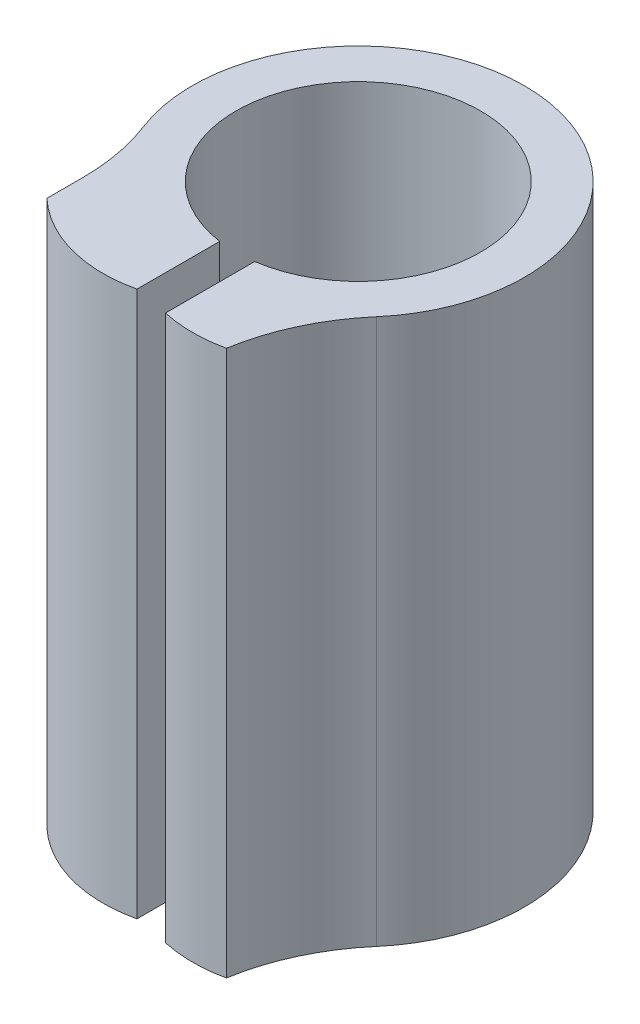
ISO-10303-21;
HEADER;
FILE_DESCRIPTION(('STEP AP214'),'2;1');
FILE_NAME('part.step','',(''),(''),'','','');
FILE_SCHEMA(('AUTOMOTIVE_DESIGN { 1 0 10303 214 1 1 1 1 }'));
ENDSEC;
DATA;
#1=APPLICATION_CONTEXT('core data for automotive mechanical design processes');
#2=APPLICATION_PROTOCOL_DEFINITION('international standard','automotive_design',2000,#1);
#3=PRODUCT_CONTEXT('',#1,'mechanical');
#4=PRODUCT('Part','Part','',(#3));
#5=PRODUCT_RELATED_PRODUCT_CATEGORY('part','',(#4));
#6=PRODUCT_DEFINITION_FORMATION('','',#4);
#7=PRODUCT_DEFINITION_CONTEXT('part definition',#1,'design');
#8=PRODUCT_DEFINITION('design','',#6,#7);
#9=PRODUCT_DEFINITION_SHAPE('','',#8);
#10=(LENGTH_UNIT() NAMED_UNIT(*) SI_UNIT(.MILLI.,.METRE.));
#11=(NAMED_UNIT(*) PLANE_ANGLE_UNIT() SI_UNIT($,.RADIAN.));
#12=(NAMED_UNIT(*) SI_UNIT($,.STERADIAN.) SOLID_ANGLE_UNIT());
#13=UNCERTAINTY_MEASURE_WITH_UNIT(LENGTH_MEASURE(1.E-05),#10,'distance_accuracy_value','');
#14=(GEOMETRIC_REPRESENTATION_CONTEXT(3) GLOBAL_UNCERTAINTY_ASSIGNED_CONTEXT((#13)) GLOBAL_UNIT_ASSIGNED_CONTEXT((#10,
#11,#12)) REPRESENTATION_CONTEXT('',''));
#15=CARTESIAN_POINT('',(0.,0.,0.));
#16=DIRECTION('',(0.,0.,1.));
#17=DIRECTION('',(1.,0.,0.));
#18=AXIS2_PLACEMENT_3D('',#15,#16,#17);
#19=CARTESIAN_POINT('',(0.,78.,0.));
#20=DIRECTION('',(0.,-1.,0.));
#21=DIRECTION('',(0.,0.,-1.));
#22=AXIS2_PLACEMENT_3D('',#19,#20,#21);
#23=CYLINDRICAL_SURFACE('',#22,14.3);
#24=CARTESIAN_POINT('',(0.,39.,0.));
#25=DIRECTION('',(0.,1.,0.));
#26=DIRECTION('',(0.,0.,1.));
#27=AXIS2_PLACEMENT_3D('',#24,#25,#26);
#28=CIRCLE('',#27,14.3);
#29=CARTESIAN_POINT('',(-2.5,39.,14.0797727254384));
#30=VERTEX_POINT('',#29);
#31=CARTESIAN_POINT('',(2.5,39.,14.0797727254384));
#32=VERTEX_POINT('',#31);
#33=EDGE_CURVE('E127',#30,#32,#28,.F.);
#34=ORIENTED_EDGE('',*,*,#33,.F.);
#35=DIRECTION('',(0.,-1.,0.));
#36=VECTOR('',#35,1.);
#37=CARTESIAN_POINT('',(-2.5,78.,14.0797727254384));
#38=LINE('',#37,#36);
#39=CARTESIAN_POINT('',(-2.5,0.,14.0797727254384));
#40=VERTEX_POINT('',#39);
#41=EDGE_CURVE('E189',#30,#40,#38,.T.);
#42=ORIENTED_EDGE('',*,*,#41,.T.);
#43=CARTESIAN_POINT('',(0.,0.,0.));
#44=DIRECTION('',(0.,-1.,0.));
#45=DIRECTION('',(0.,0.,1.));
#46=AXIS2_PLACEMENT_3D('',#43,#44,#45);
#47=CIRCLE('',#46,14.3);
#48=CARTESIAN_POINT('',(2.5,0.,14.0797727254384));
#49=VERTEX_POINT('',#48);
#50=EDGE_CURVE('E181',#40,#49,#47,.T.);
#51=ORIENTED_EDGE('',*,*,#50,.T.);
#52=DIRECTION('',(0.,-1.,0.));
#53=VECTOR('',#52,1.);
#54=CARTESIAN_POINT('',(2.5,78.,14.0797727254384));
#55=LINE('',#54,#53);
#56=EDGE_CURVE('E187',#32,#49,#55,.T.);
#57=ORIENTED_EDGE('',*,*,#56,.F.);
#58=EDGE_LOOP('',(#34,#42,#51,#57));
#59=FACE_BOUND('',#58,.T.);
#60=ADVANCED_FACE('F39',(#59),#23,.F.);
#61=CARTESIAN_POINT('',(6.86,78.,10.2433281022852));
#62=DIRECTION('',(0.,-1.,0.));
#63=DIRECTION('',(0.,0.,-1.));
#64=AXIS2_PLACEMENT_3D('',#61,#62,#63);
#65=CYLINDRICAL_SURFACE('',#64,20.3067244689253);
#66=CARTESIAN_POINT('',(6.86,0.,10.2433281022852));
#67=DIRECTION('',(0.,1.,0.));
#68=DIRECTION('',(0.,0.,1.));
#69=AXIS2_PLACEMENT_3D('',#66,#67,#68);
#70=CIRCLE('',#69,20.3067244689253);
#71=CARTESIAN_POINT('',(2.5,0.,30.0764685156652));
#72=VERTEX_POINT('',#71);
#73=CARTESIAN_POINT('',(11.22,0.,30.0764685156652));
#74=VERTEX_POINT('',#73);
#75=EDGE_CURVE('E153',#72,#74,#70,.T.);
#76=ORIENTED_EDGE('',*,*,#75,.T.);
#77=DIRECTION('',(0.,-1.,0.));
#78=VECTOR('',#77,1.);
#79=CARTESIAN_POINT('',(11.22,78.,30.0764685156652));
#80=LINE('',#79,#78);
#81=CARTESIAN_POINT('',(11.22,78.,30.0764685156652));
#82=VERTEX_POINT('',#81);
#83=EDGE_CURVE('E132',#82,#74,#80,.T.);
#84=ORIENTED_EDGE('',*,*,#83,.F.);
#85=CARTESIAN_POINT('',(6.86,78.,10.2433281022852));
#86=DIRECTION('',(0.,1.,0.));
#87=DIRECTION('',(0.,0.,1.));
#88=AXIS2_PLACEMENT_3D('',#85,#86,#87);
#89=CIRCLE('',#88,20.3067244689253);
#90=CARTESIAN_POINT('',(2.5,78.,30.0764685156652));
#91=VERTEX_POINT('',#90);
#92=EDGE_CURVE('E154',#91,#82,#89,.T.);
#93=ORIENTED_EDGE('',*,*,#92,.F.);
#94=DIRECTION('',(0.,-1.,0.));
#95=VECTOR('',#94,1.);
#96=CARTESIAN_POINT('',(2.5,78.,30.0764685156652));
#97=LINE('',#96,#95);
#98=EDGE_CURVE('E167',#91,#72,#97,.T.);
#99=ORIENTED_EDGE('',*,*,#98,.T.);
#100=EDGE_LOOP('',(#76,#84,#93,#99));
#101=FACE_BOUND('',#100,.T.);
#102=ADVANCED_FACE('F235',(#101),#65,.T.);
#103=CARTESIAN_POINT('',(0.,78.,0.));
#104=DIRECTION('',(0.,-1.,0.));
#105=DIRECTION('',(0.,0.,-1.));
#106=AXIS2_PLACEMENT_3D('',#103,#104,#105);
#107=CYLINDRICAL_SURFACE('',#106,23.75);
#108=CARTESIAN_POINT('',(0.,78.,0.));
#109=DIRECTION('',(0.,1.,0.));
#110=DIRECTION('',(0.,0.,1.));
#111=AXIS2_PLACEMENT_3D('',#108,#109,#110);
#112=CIRCLE('',#111,23.75);
#113=CARTESIAN_POINT('',(18.0359011807081,78.,15.4521444660517));
#114=VERTEX_POINT('',#113);
#115=CARTESIAN_POINT('',(-22.176976744186,78.,8.49965896303088));
#116=VERTEX_POINT('',#115);
#117=EDGE_CURVE('E156',#114,#116,#112,.T.);
#118=ORIENTED_EDGE('',*,*,#117,.F.);
#119=DIRECTION('',(0.,-1.,0.));
#120=VECTOR('',#119,1.);
#121=CARTESIAN_POINT('',(18.0359011807081,78.,15.4521444660517));
#122=LINE('',#121,#120);
#123=CARTESIAN_POINT('',(18.0359011807081,0.,15.4521444660517));
#124=VERTEX_POINT('',#123);
#125=EDGE_CURVE('E200',#114,#124,#122,.T.);
#126=ORIENTED_EDGE('',*,*,#125,.T.);
#127=CARTESIAN_POINT('',(0.,0.,0.));
#128=DIRECTION('',(0.,1.,0.));
#129=DIRECTION('',(0.,0.,1.));
#130=AXIS2_PLACEMENT_3D('',#127,#128,#129);
#131=CIRCLE('',#130,23.75);
#132=CARTESIAN_POINT('',(-22.176976744186,0.,8.49965896303088));
#133=VERTEX_POINT('',#132);
#134=EDGE_CURVE('E170',#124,#133,#131,.T.);
#135=ORIENTED_EDGE('',*,*,#134,.T.);
#136=DIRECTION('',(0.,-1.,0.));
#137=VECTOR('',#136,1.);
#138=CARTESIAN_POINT('',(-22.176976744186,78.,8.49965896303088));
#139=LINE('',#138,#137);
#140=EDGE_CURVE('E131',#133,#116,#139,.F.);
#141=ORIENTED_EDGE('',*,*,#140,.T.);
#142=EDGE_LOOP('',(#118,#126,#135,#141));
#143=FACE_BOUND('',#142,.T.);
#144=ADVANCED_FACE('F216',(#143),#107,.T.);
#145=CARTESIAN_POINT('',(-20.19,78.,24.3399795766288));
#146=DIRECTION('',(1.,0.,0.));
#147=DIRECTION('',(0.,0.,-1.));
#148=AXIS2_PLACEMENT_3D('',#145,#146,#147);
#149=PLANE('',#148);
#150=DIRECTION('',(0.,0.,1.));
#151=VECTOR('',#150,1.);
#152=CARTESIAN_POINT('',(-20.19,78.,24.3399795766288));
#153=LINE('',#152,#151);
#154=CARTESIAN_POINT('',(-20.19,78.,19.2360702847541));
#155=VERTEX_POINT('',#154);
#156=CARTESIAN_POINT('',(-20.19,78.,24.3399795766288));
#157=VERTEX_POINT('',#156);
#158=EDGE_CURVE('E159',#155,#157,#153,.T.);
#159=ORIENTED_EDGE('',*,*,#158,.F.);
#160=DIRECTION('',(0.,1.,0.));
#161=VECTOR('',#160,1.);
#162=CARTESIAN_POINT('',(-20.19,0.,19.2360702847541));
#163=LINE('',#162,#161);
#164=CARTESIAN_POINT('',(-20.19,0.,19.2360702847541));
#165=VERTEX_POINT('',#164);
#166=EDGE_CURVE('E203',#155,#165,#163,.F.);
#167=ORIENTED_EDGE('',*,*,#166,.T.);
#168=DIRECTION('',(0.,0.,1.));
#169=VECTOR('',#168,1.);
#170=CARTESIAN_POINT('',(-20.19,0.,24.3399795766288));
#171=LINE('',#170,#169);
#172=CARTESIAN_POINT('',(-20.19,0.,24.3399795766288));
#173=VERTEX_POINT('',#172);
#174=EDGE_CURVE('E173',#165,#173,#171,.T.);
#175=ORIENTED_EDGE('',*,*,#174,.T.);
#176=DIRECTION('',(0.,-1.,0.));
#177=VECTOR('',#176,1.);
#178=CARTESIAN_POINT('',(-20.19,78.,24.3399795766288));
#179=LINE('',#178,#177);
#180=EDGE_CURVE('E194',#157,#173,#179,.T.);
#181=ORIENTED_EDGE('',*,*,#180,.F.);
#182=EDGE_LOOP('',(#159,#167,#175,#181));
#183=FACE_BOUND('',#182,.T.);
#184=ADVANCED_FACE('F219',(#183),#149,.F.);
#185=CARTESIAN_POINT('',(-6.86,78.,10.2433281022852));
#186=DIRECTION('',(0.,-1.,0.));
#187=DIRECTION('',(0.,0.,-1.));
#188=AXIS2_PLACEMENT_3D('',#185,#186,#187);
#189=CYLINDRICAL_SURFACE('',#188,19.4011464297632);
#190=CARTESIAN_POINT('',(-6.86,0.,10.2433281022852));
#191=DIRECTION('',(0.,1.,0.));
#192=DIRECTION('',(0.,0.,-1.));
#193=AXIS2_PLACEMENT_3D('',#190,#191,#192);
#194=CIRCLE('',#193,19.4011464297632);
#195=CARTESIAN_POINT('',(-2.5,0.,29.1482185486516));
#196=VERTEX_POINT('',#195);
#197=EDGE_CURVE('E175',#173,#196,#194,.T.);
#198=ORIENTED_EDGE('',*,*,#197,.T.);
#199=DIRECTION('',(0.,-1.,0.));
#200=VECTOR('',#199,1.);
#201=CARTESIAN_POINT('',(-2.5,78.,29.1482185486516));
#202=LINE('',#201,#200);
#203=CARTESIAN_POINT('',(-2.5,78.,29.1482185486516));
#204=VERTEX_POINT('',#203);
#205=EDGE_CURVE('E191',#204,#196,#202,.T.);
#206=ORIENTED_EDGE('',*,*,#205,.F.);
#207=CARTESIAN_POINT('',(-6.86,78.,10.2433281022852));
#208=DIRECTION('',(0.,1.,0.));
#209=DIRECTION('',(0.,0.,-1.));
#210=AXIS2_PLACEMENT_3D('',#207,#208,#209);
#211=CIRCLE('',#210,19.4011464297632);
#212=EDGE_CURVE('E161',#157,#204,#211,.T.);
#213=ORIENTED_EDGE('',*,*,#212,.F.);
#214=ORIENTED_EDGE('',*,*,#180,.T.);
#215=EDGE_LOOP('',(#198,#206,#213,#214));
#216=FACE_BOUND('',#215,.T.);
#217=ADVANCED_FACE('F226',(#216),#189,.T.);
#218=CARTESIAN_POINT('',(-2.5,78.,14.0797727254384));
#219=DIRECTION('',(-1.,0.,0.));
#220=DIRECTION('',(0.,0.,1.));
#221=AXIS2_PLACEMENT_3D('',#218,#219,#220);
#222=PLANE('',#221);
#223=DIRECTION('',(0.,0.,-1.));
#224=VECTOR('',#223,1.);
#225=CARTESIAN_POINT('',(-2.5,39.,14.0797727254384));
#226=LINE('',#225,#224);
#227=CARTESIAN_POINT('',(-2.5,39.,17.3205080756888));
#228=VERTEX_POINT('',#227);
#229=EDGE_CURVE('E151',#228,#30,#226,.T.);
#230=ORIENTED_EDGE('',*,*,#229,.F.);
#231=DIRECTION('',(0.,1.,0.));
#232=VECTOR('',#231,1.);
#233=CARTESIAN_POINT('',(-2.5,39.,17.3205080756888));
#234=LINE('',#233,#232);
#235=CARTESIAN_POINT('',(-2.5,78.,17.3205080756888));
#236=VERTEX_POINT('',#235);
#237=EDGE_CURVE('E139',#228,#236,#234,.T.);
#238=ORIENTED_EDGE('',*,*,#237,.T.);
#239=DIRECTION('',(0.,0.,-1.));
#240=VECTOR('',#239,1.);
#241=CARTESIAN_POINT('',(-2.5,78.,21.0064685156652));
#242=LINE('',#241,#240);
#243=EDGE_CURVE('E163',#204,#236,#242,.T.);
#244=ORIENTED_EDGE('',*,*,#243,.F.);
#245=ORIENTED_EDGE('',*,*,#205,.T.);
#246=DIRECTION('',(0.,0.,-1.));
#247=VECTOR('',#246,1.);
#248=CARTESIAN_POINT('',(-2.5,0.,14.0797727254384));
#249=LINE('',#248,#247);
#250=EDGE_CURVE('E178',#196,#40,#249,.T.);
#251=ORIENTED_EDGE('',*,*,#250,.T.);
#252=ORIENTED_EDGE('',*,*,#41,.F.);
#253=EDGE_LOOP('',(#230,#238,#244,#245,#251,#252));
#254=FACE_BOUND('',#253,.T.);
#255=ADVANCED_FACE('F228',(#254),#222,.F.);
#256=CARTESIAN_POINT('',(2.5,78.,21.0064685156652));
#257=DIRECTION('',(1.,0.,0.));
#258=DIRECTION('',(0.,0.,-1.));
#259=AXIS2_PLACEMENT_3D('',#256,#257,#258);
#260=PLANE('',#259);
#261=DIRECTION('',(0.,0.,1.));
#262=VECTOR('',#261,1.);
#263=CARTESIAN_POINT('',(2.5,78.,14.0797727254384));
#264=LINE('',#263,#262);
#265=CARTESIAN_POINT('',(2.5,78.,17.3205080756888));
#266=VERTEX_POINT('',#265);
#267=EDGE_CURVE('E145',#266,#91,#264,.T.);
#268=ORIENTED_EDGE('',*,*,#267,.F.);
#269=DIRECTION('',(0.,1.,0.));
#270=VECTOR('',#269,1.);
#271=CARTESIAN_POINT('',(2.5,39.,17.3205080756888));
#272=LINE('',#271,#270);
#273=CARTESIAN_POINT('',(2.5,39.,17.3205080756888));
#274=VERTEX_POINT('',#273);
#275=EDGE_CURVE('E136',#266,#274,#272,.F.);
#276=ORIENTED_EDGE('',*,*,#275,.T.);
#277=DIRECTION('',(0.,0.,1.));
#278=VECTOR('',#277,1.);
#279=CARTESIAN_POINT('',(2.5,39.,21.0064685156652));
#280=LINE('',#279,#278);
#281=EDGE_CURVE('E121',#32,#274,#280,.T.);
#282=ORIENTED_EDGE('',*,*,#281,.F.);
#283=ORIENTED_EDGE('',*,*,#56,.T.);
#284=DIRECTION('',(0.,0.,1.));
#285=VECTOR('',#284,1.);
#286=CARTESIAN_POINT('',(2.5,0.,21.0064685156652));
#287=LINE('',#286,#285);
#288=EDGE_CURVE('E157',#49,#72,#287,.T.);
#289=ORIENTED_EDGE('',*,*,#288,.T.);
#290=ORIENTED_EDGE('',*,*,#98,.F.);
#291=EDGE_LOOP('',(#268,#276,#282,#283,#289,#290));
#292=FACE_BOUND('',#291,.T.);
#293=ADVANCED_FACE('F143',(#292),#260,.F.);
#294=CARTESIAN_POINT('',(6.86,78.,10.2433281022852));
#295=DIRECTION('',(0.,1.,0.));
#296=DIRECTION('',(0.,0.,1.));
#297=AXIS2_PLACEMENT_3D('',#294,#295,#296);
#298=PLANE('',#297);
#299=CARTESIAN_POINT('',(0.,78.,0.));
#300=DIRECTION('',(0.,1.,0.));
#301=DIRECTION('',(0.,0.,1.));
#302=AXIS2_PLACEMENT_3D('',#299,#300,#301);
#303=CIRCLE('',#302,17.5);
#304=EDGE_CURVE('E140',#266,#236,#303,.T.);
#305=ORIENTED_EDGE('',*,*,#304,.F.);
#306=ORIENTED_EDGE('',*,*,#267,.T.);
#307=ORIENTED_EDGE('',*,*,#92,.T.);
#308=CARTESIAN_POINT('',(40.8180921458132,78.,34.970642738959));
#309=DIRECTION('',(0.,1.,0.));
#310=DIRECTION('',(0.,0.,1.));
#311=AXIS2_PLACEMENT_3D('',#308,#309,#310);
#312=CIRCLE('',#311,30.);
#313=EDGE_CURVE('E207',#82,#114,#312,.F.);
#314=ORIENTED_EDGE('',*,*,#313,.T.);
#315=ORIENTED_EDGE('',*,*,#117,.T.);
#316=CARTESIAN_POINT('',(-50.19,78.,19.2360702847541));
#317=DIRECTION('',(0.,1.,0.));
#318=DIRECTION('',(0.,0.,1.));
#319=AXIS2_PLACEMENT_3D('',#316,#317,#318);
#320=CIRCLE('',#319,30.);
#321=EDGE_CURVE('E11',#116,#155,#320,.F.);
#322=ORIENTED_EDGE('',*,*,#321,.T.);
#323=ORIENTED_EDGE('',*,*,#158,.T.);
#324=ORIENTED_EDGE('',*,*,#212,.T.);
#325=ORIENTED_EDGE('',*,*,#243,.T.);
#326=EDGE_LOOP('',(#305,#306,#307,#314,#315,#322,#323,#324,#325));
#327=FACE_BOUND('',#326,.T.);
#328=ADVANCED_FACE('F222',(#327),#298,.T.);
#329=CARTESIAN_POINT('',(6.86,0.,10.2433281022852));
#330=DIRECTION('',(0.,1.,0.));
#331=DIRECTION('',(0.,0.,1.));
#332=AXIS2_PLACEMENT_3D('',#329,#330,#331);
#333=PLANE('',#332);
#334=ORIENTED_EDGE('',*,*,#75,.F.);
#335=ORIENTED_EDGE('',*,*,#288,.F.);
#336=ORIENTED_EDGE('',*,*,#50,.F.);
#337=ORIENTED_EDGE('',*,*,#250,.F.);
#338=ORIENTED_EDGE('',*,*,#197,.F.);
#339=ORIENTED_EDGE('',*,*,#174,.F.);
#340=CARTESIAN_POINT('',(-50.19,0.,19.2360702847541));
#341=DIRECTION('',(0.,1.,0.));
#342=DIRECTION('',(0.,0.,1.));
#343=AXIS2_PLACEMENT_3D('',#340,#341,#342);
#344=CIRCLE('',#343,30.);
#345=EDGE_CURVE('E47',#165,#133,#344,.T.);
#346=ORIENTED_EDGE('',*,*,#345,.T.);
#347=ORIENTED_EDGE('',*,*,#134,.F.);
#348=CARTESIAN_POINT('',(40.8180921458132,0.,34.970642738959));
#349=DIRECTION('',(0.,1.,0.));
#350=DIRECTION('',(0.,0.,1.));
#351=AXIS2_PLACEMENT_3D('',#348,#349,#350);
#352=CIRCLE('',#351,30.);
#353=EDGE_CURVE('E205',#124,#74,#352,.T.);
#354=ORIENTED_EDGE('',*,*,#353,.T.);
#355=EDGE_LOOP('',(#334,#335,#336,#337,#338,#339,#346,#347,#354));
#356=FACE_BOUND('',#355,.T.);
#357=ADVANCED_FACE('F212',(#356),#333,.F.);
#358=CARTESIAN_POINT('',(0.,39.,0.));
#359=DIRECTION('',(0.,1.,0.));
#360=DIRECTION('',(0.,0.,1.));
#361=AXIS2_PLACEMENT_3D('',#358,#359,#360);
#362=PLANE('',#361);
#363=ORIENTED_EDGE('',*,*,#229,.T.);
#364=ORIENTED_EDGE('',*,*,#33,.T.);
#365=ORIENTED_EDGE('',*,*,#281,.T.);
#366=CARTESIAN_POINT('',(0.,39.,0.));
#367=DIRECTION('',(0.,1.,0.));
#368=DIRECTION('',(0.,0.,1.));
#369=AXIS2_PLACEMENT_3D('',#366,#367,#368);
#370=CIRCLE('',#369,17.5);
#371=EDGE_CURVE('E124',#274,#228,#370,.T.);
#372=ORIENTED_EDGE('',*,*,#371,.T.);
#373=EDGE_LOOP('',(#363,#364,#365,#372));
#374=FACE_BOUND('',#373,.T.);
#375=ADVANCED_FACE('F123',(#374),#362,.T.);
#376=CARTESIAN_POINT('',(0.,39.,0.));
#377=DIRECTION('',(0.,1.,0.));
#378=DIRECTION('',(0.,0.,1.));
#379=AXIS2_PLACEMENT_3D('',#376,#377,#378);
#380=CYLINDRICAL_SURFACE('',#379,17.5);
#381=ORIENTED_EDGE('',*,*,#371,.F.);
#382=ORIENTED_EDGE('',*,*,#275,.F.);
#383=ORIENTED_EDGE('',*,*,#304,.T.);
#384=ORIENTED_EDGE('',*,*,#237,.F.);
#385=EDGE_LOOP('',(#381,#382,#383,#384));
#386=FACE_BOUND('',#385,.T.);
#387=ADVANCED_FACE('F135',(#386),#380,.F.);
#388=CARTESIAN_POINT('',(40.8180921458132,78.,34.970642738959));
#389=DIRECTION('',(0.,1.,0.));
#390=DIRECTION('',(0.,0.,1.));
#391=AXIS2_PLACEMENT_3D('',#388,#389,#390);
#392=CYLINDRICAL_SURFACE('',#391,30.);
#393=ORIENTED_EDGE('',*,*,#313,.F.);
#394=ORIENTED_EDGE('',*,*,#83,.T.);
#395=ORIENTED_EDGE('',*,*,#353,.F.);
#396=ORIENTED_EDGE('',*,*,#125,.F.);
#397=EDGE_LOOP('',(#393,#394,#395,#396));
#398=FACE_BOUND('',#397,.T.);
#399=ADVANCED_FACE('F239',(#398),#392,.F.);
#400=CARTESIAN_POINT('',(-50.19,78.,19.2360702847541));
#401=DIRECTION('',(0.,-1.,0.));
#402=DIRECTION('',(0.,0.,-1.));
#403=AXIS2_PLACEMENT_3D('',#400,#401,#402);
#404=CYLINDRICAL_SURFACE('',#403,30.);
#405=ORIENTED_EDGE('',*,*,#321,.F.);
#406=ORIENTED_EDGE('',*,*,#140,.F.);
#407=ORIENTED_EDGE('',*,*,#345,.F.);
#408=ORIENTED_EDGE('',*,*,#166,.F.);
#409=EDGE_LOOP('',(#405,#406,#407,#408));
#410=FACE_BOUND('',#409,.T.);
#411=ADVANCED_FACE('F41',(#410),#404,.F.);
#412=CLOSED_SHELL('',(#60,#102,#144,#184,#217,#255,#293,#328,#357,#375,#387,#399,#411));
#413=MANIFOLD_SOLID_BREP('B2',#412);
#414=ADVANCED_BREP_SHAPE_REPRESENTATION('',(#18,#413),#14);
#415=SHAPE_DEFINITION_REPRESENTATION(#9,#414);
ENDSEC;
END-ISO-10303-21;
